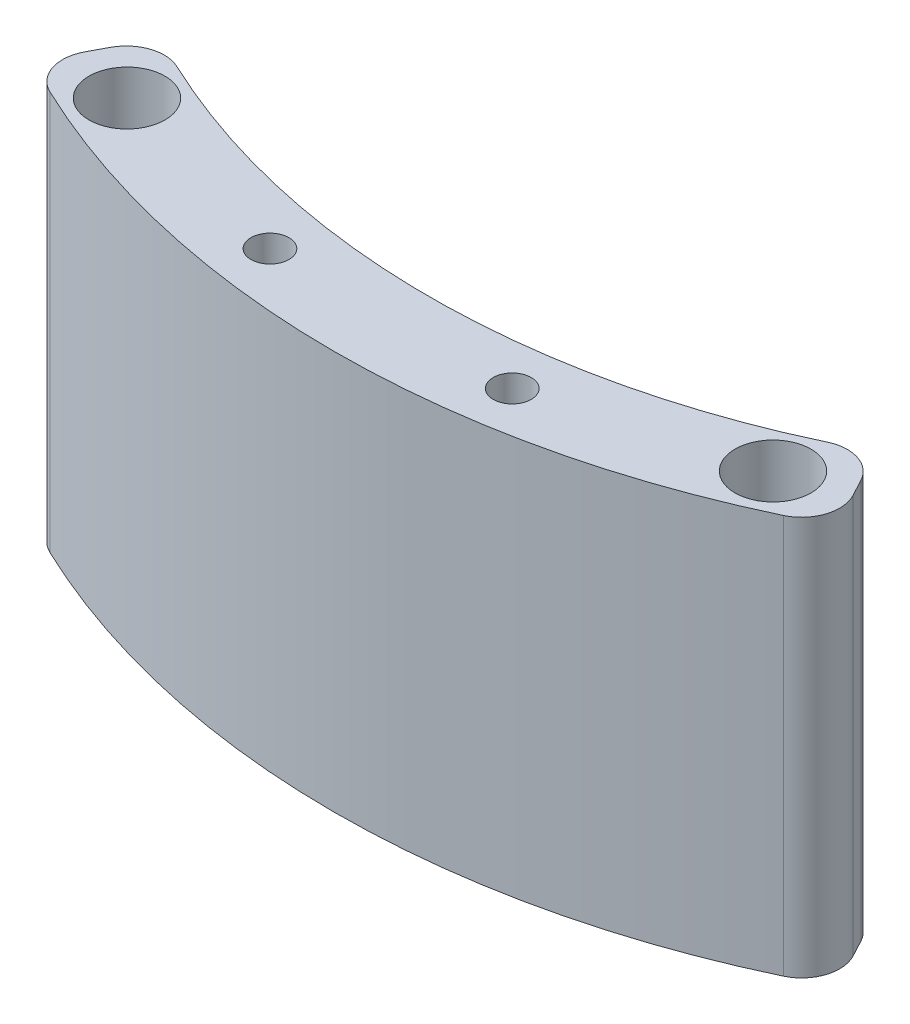
ISO-10303-21;
HEADER;
FILE_DESCRIPTION(('STEP AP214'),'2;1');
FILE_NAME('part.step','',(''),(''),'','','');
FILE_SCHEMA(('AUTOMOTIVE_DESIGN { 1 0 10303 214 1 1 1 1 }'));
ENDSEC;
DATA;
#1=APPLICATION_CONTEXT('core data for automotive mechanical design processes');
#2=APPLICATION_PROTOCOL_DEFINITION('international standard','automotive_design',2000,#1);
#3=PRODUCT_CONTEXT('',#1,'mechanical');
#4=PRODUCT('Part','Part','',(#3));
#5=PRODUCT_RELATED_PRODUCT_CATEGORY('part','',(#4));
#6=PRODUCT_DEFINITION_FORMATION('','',#4);
#7=PRODUCT_DEFINITION_CONTEXT('part definition',#1,'design');
#8=PRODUCT_DEFINITION('design','',#6,#7);
#9=PRODUCT_DEFINITION_SHAPE('','',#8);
#10=(LENGTH_UNIT() NAMED_UNIT(*) SI_UNIT(.MILLI.,.METRE.));
#11=(NAMED_UNIT(*) PLANE_ANGLE_UNIT() SI_UNIT($,.RADIAN.));
#12=(NAMED_UNIT(*) SI_UNIT($,.STERADIAN.) SOLID_ANGLE_UNIT());
#13=UNCERTAINTY_MEASURE_WITH_UNIT(LENGTH_MEASURE(1.E-05),#10,'distance_accuracy_value','');
#14=(GEOMETRIC_REPRESENTATION_CONTEXT(3) GLOBAL_UNCERTAINTY_ASSIGNED_CONTEXT((#13)) GLOBAL_UNIT_ASSIGNED_CONTEXT((#10,
#11,#12)) REPRESENTATION_CONTEXT('',''));
#15=CARTESIAN_POINT('',(0.,0.,0.));
#16=DIRECTION('',(0.,0.,1.));
#17=DIRECTION('',(1.,0.,0.));
#18=AXIS2_PLACEMENT_3D('',#15,#16,#17);
#19=CARTESIAN_POINT('',(0.,42.,-90.));
#20=DIRECTION('',(0.,-1.,0.));
#21=DIRECTION('',(0.,0.,-1.));
#22=AXIS2_PLACEMENT_3D('',#19,#20,#21);
#23=CYLINDRICAL_SURFACE('',#22,80.);
#24=CARTESIAN_POINT('',(0.,0.,-90.));
#25=DIRECTION('',(0.,-1.,0.));
#26=DIRECTION('',(0.,0.,1.));
#27=AXIS2_PLACEMENT_3D('',#24,#25,#26);
#28=CIRCLE('',#27,80.);
#29=CARTESIAN_POINT('',(34.2430063209466,0.,-17.699125052987));
#30=VERTEX_POINT('',#29);
#31=CARTESIAN_POINT('',(-34.2430063209466,0.,-17.699125052987));
#32=VERTEX_POINT('',#31);
#33=EDGE_CURVE('E139',#30,#32,#28,.T.);
#34=ORIENTED_EDGE('',*,*,#33,.T.);
#35=DIRECTION('',(0.,-1.,0.));
#36=VECTOR('',#35,1.);
#37=CARTESIAN_POINT('',(-34.2430063209466,42.,-17.699125052987));
#38=LINE('',#37,#36);
#39=CARTESIAN_POINT('',(-34.2430063209466,42.,-17.699125052987));
#40=VERTEX_POINT('',#39);
#41=EDGE_CURVE('E114',#32,#40,#38,.F.);
#42=ORIENTED_EDGE('',*,*,#41,.T.);
#43=CARTESIAN_POINT('',(0.,42.,-90.));
#44=DIRECTION('',(0.,-1.,0.));
#45=DIRECTION('',(0.,0.,1.));
#46=AXIS2_PLACEMENT_3D('',#43,#44,#45);
#47=CIRCLE('',#46,80.);
#48=CARTESIAN_POINT('',(34.2430063209466,42.,-17.699125052987));
#49=VERTEX_POINT('',#48);
#50=EDGE_CURVE('E152',#49,#40,#47,.T.);
#51=ORIENTED_EDGE('',*,*,#50,.F.);
#52=DIRECTION('',(0.,-1.,0.));
#53=VECTOR('',#52,1.);
#54=CARTESIAN_POINT('',(34.2430063209466,42.,-17.699125052987));
#55=LINE('',#54,#53);
#56=EDGE_CURVE('E120',#49,#30,#55,.T.);
#57=ORIENTED_EDGE('',*,*,#56,.T.);
#58=EDGE_LOOP('',(#34,#42,#51,#57));
#59=FACE_BOUND('',#58,.T.);
#60=ADVANCED_FACE('F43',(#59),#23,.F.);
#61=CARTESIAN_POINT('',(-37.6470588235294,42.,-19.4117647058824));
#62=DIRECTION('',(0.882352941176471,0.,0.470588235294117));
#63=DIRECTION('',(0.470588235294117,0.,-0.882352941176471));
#64=AXIS2_PLACEMENT_3D('',#61,#62,#63);
#65=PLANE('',#64);
#66=DIRECTION('',(-0.470588235294117,0.,0.882352941176471));
#67=VECTOR('',#66,1.);
#68=CARTESIAN_POINT('',(-37.6470588235294,42.,-19.4117647058824));
#69=LINE('',#68,#67);
#70=CARTESIAN_POINT('',(-39.4845684016998,42.,-15.9664342468128));
#71=VERTEX_POINT('',#70);
#72=CARTESIAN_POINT('',(-40.426788884545,42.,-14.1997708414781));
#73=VERTEX_POINT('',#72);
#74=EDGE_CURVE('E130',#71,#73,#69,.T.);
#75=ORIENTED_EDGE('',*,*,#74,.F.);
#76=DIRECTION('',(0.,-1.,0.));
#77=VECTOR('',#76,1.);
#78=CARTESIAN_POINT('',(-39.4845684016998,42.,-15.9664342468128));
#79=LINE('',#78,#77);
#80=CARTESIAN_POINT('',(-39.4845684016998,0.,-15.9664342468128));
#81=VERTEX_POINT('',#80);
#82=EDGE_CURVE('E113',#71,#81,#79,.T.);
#83=ORIENTED_EDGE('',*,*,#82,.T.);
#84=DIRECTION('',(-0.470588235294117,0.,0.882352941176471));
#85=VECTOR('',#84,1.);
#86=CARTESIAN_POINT('',(-37.6470588235294,0.,-19.4117647058824));
#87=LINE('',#86,#85);
#88=CARTESIAN_POINT('',(-40.426788884545,0.,-14.1997708414781));
#89=VERTEX_POINT('',#88);
#90=EDGE_CURVE('E127',#81,#89,#87,.T.);
#91=ORIENTED_EDGE('',*,*,#90,.T.);
#92=DIRECTION('',(0.,-1.,0.));
#93=VECTOR('',#92,1.);
#94=CARTESIAN_POINT('',(-40.426788884545,42.,-14.1997708414781));
#95=LINE('',#94,#93);
#96=EDGE_CURVE('E133',#89,#73,#95,.F.);
#97=ORIENTED_EDGE('',*,*,#96,.T.);
#98=EDGE_LOOP('',(#75,#83,#91,#97));
#99=FACE_BOUND('',#98,.T.);
#100=ADVANCED_FACE('F126',(#99),#65,.F.);
#101=CARTESIAN_POINT('',(0.,42.,-90.));
#102=DIRECTION('',(0.,-1.,0.));
#103=DIRECTION('',(0.,0.,-1.));
#104=AXIS2_PLACEMENT_3D('',#101,#102,#103);
#105=CYLINDRICAL_SURFACE('',#104,90.);
#106=CARTESIAN_POINT('',(0.,42.,-90.));
#107=DIRECTION('',(0.,1.,0.));
#108=DIRECTION('',(0.,0.,1.));
#109=AXIS2_PLACEMENT_3D('',#106,#107,#108);
#110=CIRCLE('',#109,90.);
#111=CARTESIAN_POINT('',(-38.6135341951805,42.,-8.70427454682732));
#112=VERTEX_POINT('',#111);
#113=CARTESIAN_POINT('',(38.6135341951805,42.,-8.70427454682732));
#114=VERTEX_POINT('',#113);
#115=EDGE_CURVE('E201',#112,#114,#110,.T.);
#116=ORIENTED_EDGE('',*,*,#115,.F.);
#117=DIRECTION('',(0.,-1.,0.));
#118=VECTOR('',#117,1.);
#119=CARTESIAN_POINT('',(-38.6135341951805,42.,-8.70427454682732));
#120=LINE('',#119,#118);
#121=CARTESIAN_POINT('',(-38.6135341951805,0.,-8.70427454682732));
#122=VERTEX_POINT('',#121);
#123=EDGE_CURVE('E182',#112,#122,#120,.T.);
#124=ORIENTED_EDGE('',*,*,#123,.T.);
#125=CARTESIAN_POINT('',(0.,0.,-90.));
#126=DIRECTION('',(0.,1.,0.));
#127=DIRECTION('',(0.,0.,1.));
#128=AXIS2_PLACEMENT_3D('',#125,#126,#127);
#129=CIRCLE('',#128,90.);
#130=CARTESIAN_POINT('',(38.6135341951805,0.,-8.70427454682732));
#131=VERTEX_POINT('',#130);
#132=EDGE_CURVE('E138',#122,#131,#129,.T.);
#133=ORIENTED_EDGE('',*,*,#132,.T.);
#134=DIRECTION('',(0.,-1.,0.));
#135=VECTOR('',#134,1.);
#136=CARTESIAN_POINT('',(38.6135341951805,42.,-8.70427454682732));
#137=LINE('',#136,#135);
#138=EDGE_CURVE('E179',#131,#114,#137,.F.);
#139=ORIENTED_EDGE('',*,*,#138,.T.);
#140=EDGE_LOOP('',(#116,#124,#133,#139));
#141=FACE_BOUND('',#140,.T.);
#142=ADVANCED_FACE('F219',(#141),#105,.T.);
#143=CARTESIAN_POINT('',(37.6470588235294,42.,-19.4117647058823));
#144=DIRECTION('',(-0.88235294117647,0.,0.470588235294118));
#145=DIRECTION('',(0.470588235294118,0.,0.88235294117647));
#146=AXIS2_PLACEMENT_3D('',#143,#144,#145);
#147=PLANE('',#146);
#148=DIRECTION('',(-0.470588235294118,0.,-0.88235294117647));
#149=VECTOR('',#148,1.);
#150=CARTESIAN_POINT('',(37.6470588235294,0.,-19.4117647058823));
#151=LINE('',#150,#149);
#152=CARTESIAN_POINT('',(40.426788884545,0.,-14.1997708414781));
#153=VERTEX_POINT('',#152);
#154=CARTESIAN_POINT('',(39.4845684016998,0.,-15.9664342468128));
#155=VERTEX_POINT('',#154);
#156=EDGE_CURVE('E144',#153,#155,#151,.T.);
#157=ORIENTED_EDGE('',*,*,#156,.T.);
#158=DIRECTION('',(0.,-1.,0.));
#159=VECTOR('',#158,1.);
#160=CARTESIAN_POINT('',(39.4845684016998,42.,-15.9664342468128));
#161=LINE('',#160,#159);
#162=CARTESIAN_POINT('',(39.4845684016998,42.,-15.9664342468128));
#163=VERTEX_POINT('',#162);
#164=EDGE_CURVE('E11',#155,#163,#161,.F.);
#165=ORIENTED_EDGE('',*,*,#164,.T.);
#166=DIRECTION('',(-0.470588235294118,0.,-0.88235294117647));
#167=VECTOR('',#166,1.);
#168=CARTESIAN_POINT('',(37.6470588235294,42.,-19.4117647058823));
#169=LINE('',#168,#167);
#170=CARTESIAN_POINT('',(40.426788884545,42.,-14.1997708414781));
#171=VERTEX_POINT('',#170);
#172=EDGE_CURVE('E154',#171,#163,#169,.T.);
#173=ORIENTED_EDGE('',*,*,#172,.F.);
#174=DIRECTION('',(0.,-1.,0.));
#175=VECTOR('',#174,1.);
#176=CARTESIAN_POINT('',(40.426788884545,42.,-14.1997708414781));
#177=LINE('',#176,#175);
#178=EDGE_CURVE('E52',#171,#153,#177,.T.);
#179=ORIENTED_EDGE('',*,*,#178,.T.);
#180=EDGE_LOOP('',(#157,#165,#173,#179));
#181=FACE_BOUND('',#180,.T.);
#182=ADVANCED_FACE('F189',(#181),#147,.F.);
#183=CARTESIAN_POINT('',(0.,42.,-90.));
#184=DIRECTION('',(0.,1.,0.));
#185=DIRECTION('',(0.,0.,1.));
#186=AXIS2_PLACEMENT_3D('',#183,#184,#185);
#187=PLANE('',#186);
#188=CARTESIAN_POINT('',(-12.75,42.,-6.));
#189=DIRECTION('',(0.,1.,0.));
#190=DIRECTION('',(0.,0.,1.));
#191=AXIS2_PLACEMENT_3D('',#188,#189,#190);
#192=CIRCLE('',#191,2.);
#193=CARTESIAN_POINT('',(-12.75,42.,-4.));
#194=VERTEX_POINT('',#193);
#195=EDGE_CURVE('E373',#194,#194,#192,.T.);
#196=ORIENTED_EDGE('',*,*,#195,.F.);
#197=EDGE_LOOP('',(#196));
#198=FACE_BOUND('',#197,.T.);
#199=CARTESIAN_POINT('',(12.75,42.,-6.));
#200=DIRECTION('',(0.,1.,0.));
#201=DIRECTION('',(0.,0.,1.));
#202=AXIS2_PLACEMENT_3D('',#199,#200,#201);
#203=CIRCLE('',#202,2.);
#204=CARTESIAN_POINT('',(12.75,42.,-4.));
#205=VERTEX_POINT('',#204);
#206=EDGE_CURVE('E375',#205,#205,#203,.T.);
#207=ORIENTED_EDGE('',*,*,#206,.F.);
#208=EDGE_LOOP('',(#207));
#209=FACE_BOUND('',#208,.T.);
#210=CARTESIAN_POINT('',(-34.,42.,-12.2));
#211=DIRECTION('',(0.,1.,0.));
#212=DIRECTION('',(0.,0.,1.));
#213=AXIS2_PLACEMENT_3D('',#210,#211,#212);
#214=CIRCLE('',#213,4.);
#215=CARTESIAN_POINT('',(-34.,42.,-8.2));
#216=VERTEX_POINT('',#215);
#217=EDGE_CURVE('E390',#216,#216,#214,.T.);
#218=ORIENTED_EDGE('',*,*,#217,.F.);
#219=EDGE_LOOP('',(#218));
#220=FACE_BOUND('',#219,.T.);
#221=CARTESIAN_POINT('',(34.,42.,-12.2));
#222=DIRECTION('',(0.,1.,0.));
#223=DIRECTION('',(0.,0.,1.));
#224=AXIS2_PLACEMENT_3D('',#221,#222,#223);
#225=CIRCLE('',#224,4.);
#226=CARTESIAN_POINT('',(34.,42.,-8.20000000000001));
#227=VERTEX_POINT('',#226);
#228=EDGE_CURVE('E393',#227,#227,#225,.T.);
#229=ORIENTED_EDGE('',*,*,#228,.F.);
#230=EDGE_LOOP('',(#229));
#231=FACE_BOUND('',#230,.T.);
#232=ORIENTED_EDGE('',*,*,#50,.T.);
#233=CARTESIAN_POINT('',(-35.9551566369939,42.,-14.0840813056364));
#234=DIRECTION('',(0.,1.,0.));
#235=DIRECTION('',(0.,0.,1.));
#236=AXIS2_PLACEMENT_3D('',#233,#234,#235);
#237=CIRCLE('',#236,4.);
#238=EDGE_CURVE('E176',#40,#71,#237,.T.);
#239=ORIENTED_EDGE('',*,*,#238,.T.);
#240=ORIENTED_EDGE('',*,*,#74,.T.);
#241=CARTESIAN_POINT('',(-36.8973771198391,42.,-12.3174179003017));
#242=DIRECTION('',(0.,1.,0.));
#243=DIRECTION('',(0.,0.,1.));
#244=AXIS2_PLACEMENT_3D('',#241,#242,#243);
#245=CIRCLE('',#244,4.);
#246=EDGE_CURVE('E173',#73,#112,#245,.T.);
#247=ORIENTED_EDGE('',*,*,#246,.T.);
#248=ORIENTED_EDGE('',*,*,#115,.T.);
#249=CARTESIAN_POINT('',(36.8973771198391,42.,-12.3174179003017));
#250=DIRECTION('',(0.,1.,0.));
#251=DIRECTION('',(0.,0.,1.));
#252=AXIS2_PLACEMENT_3D('',#249,#250,#251);
#253=CIRCLE('',#252,4.);
#254=EDGE_CURVE('E64',#114,#171,#253,.T.);
#255=ORIENTED_EDGE('',*,*,#254,.T.);
#256=ORIENTED_EDGE('',*,*,#172,.T.);
#257=CARTESIAN_POINT('',(35.9551566369939,42.,-14.0840813056364));
#258=DIRECTION('',(0.,1.,0.));
#259=DIRECTION('',(0.,0.,1.));
#260=AXIS2_PLACEMENT_3D('',#257,#258,#259);
#261=CIRCLE('',#260,4.);
#262=EDGE_CURVE('E170',#163,#49,#261,.T.);
#263=ORIENTED_EDGE('',*,*,#262,.T.);
#264=EDGE_LOOP('',(#232,#239,#240,#247,#248,#255,#256,#263));
#265=FACE_BOUND('',#264,.T.);
#266=ADVANCED_FACE('F209',(#198,#209,#220,#231,#265),#187,.T.);
#267=CARTESIAN_POINT('',(0.,0.,-90.));
#268=DIRECTION('',(0.,1.,0.));
#269=DIRECTION('',(0.,0.,1.));
#270=AXIS2_PLACEMENT_3D('',#267,#268,#269);
#271=PLANE('',#270);
#272=CARTESIAN_POINT('',(-12.75,0.,-6.));
#273=DIRECTION('',(0.,1.,0.));
#274=DIRECTION('',(0.,0.,1.));
#275=AXIS2_PLACEMENT_3D('',#272,#273,#274);
#276=CIRCLE('',#275,2.);
#277=CARTESIAN_POINT('',(-12.75,0.,-4.));
#278=VERTEX_POINT('',#277);
#279=EDGE_CURVE('E371',#278,#278,#276,.T.);
#280=ORIENTED_EDGE('',*,*,#279,.T.);
#281=EDGE_LOOP('',(#280));
#282=FACE_BOUND('',#281,.T.);
#283=CARTESIAN_POINT('',(12.75,0.,-6.));
#284=DIRECTION('',(0.,1.,0.));
#285=DIRECTION('',(0.,0.,1.));
#286=AXIS2_PLACEMENT_3D('',#283,#284,#285);
#287=CIRCLE('',#286,2.);
#288=CARTESIAN_POINT('',(12.75,0.,-4.));
#289=VERTEX_POINT('',#288);
#290=EDGE_CURVE('E381',#289,#289,#287,.T.);
#291=ORIENTED_EDGE('',*,*,#290,.T.);
#292=EDGE_LOOP('',(#291));
#293=FACE_BOUND('',#292,.T.);
#294=CARTESIAN_POINT('',(-34.,0.,-12.2));
#295=DIRECTION('',(0.,1.,0.));
#296=DIRECTION('',(0.,0.,1.));
#297=AXIS2_PLACEMENT_3D('',#294,#295,#296);
#298=CIRCLE('',#297,4.);
#299=CARTESIAN_POINT('',(-34.,0.,-8.2));
#300=VERTEX_POINT('',#299);
#301=EDGE_CURVE('E146',#300,#300,#298,.T.);
#302=ORIENTED_EDGE('',*,*,#301,.T.);
#303=EDGE_LOOP('',(#302));
#304=FACE_BOUND('',#303,.T.);
#305=CARTESIAN_POINT('',(34.,0.,-12.2));
#306=DIRECTION('',(0.,1.,0.));
#307=DIRECTION('',(0.,0.,1.));
#308=AXIS2_PLACEMENT_3D('',#305,#306,#307);
#309=CIRCLE('',#308,4.);
#310=CARTESIAN_POINT('',(34.,0.,-8.20000000000001));
#311=VERTEX_POINT('',#310);
#312=EDGE_CURVE('E204',#311,#311,#309,.T.);
#313=ORIENTED_EDGE('',*,*,#312,.T.);
#314=EDGE_LOOP('',(#313));
#315=FACE_BOUND('',#314,.T.);
#316=ORIENTED_EDGE('',*,*,#90,.F.);
#317=CARTESIAN_POINT('',(-35.9551566369939,0.,-14.0840813056364));
#318=DIRECTION('',(0.,1.,0.));
#319=DIRECTION('',(0.,0.,1.));
#320=AXIS2_PLACEMENT_3D('',#317,#318,#319);
#321=CIRCLE('',#320,4.);
#322=EDGE_CURVE('E109',#81,#32,#321,.F.);
#323=ORIENTED_EDGE('',*,*,#322,.T.);
#324=ORIENTED_EDGE('',*,*,#33,.F.);
#325=CARTESIAN_POINT('',(35.9551566369939,0.,-14.0840813056364));
#326=DIRECTION('',(0.,1.,0.));
#327=DIRECTION('',(0.,0.,1.));
#328=AXIS2_PLACEMENT_3D('',#325,#326,#327);
#329=CIRCLE('',#328,4.);
#330=EDGE_CURVE('E158',#30,#155,#329,.F.);
#331=ORIENTED_EDGE('',*,*,#330,.T.);
#332=ORIENTED_EDGE('',*,*,#156,.F.);
#333=CARTESIAN_POINT('',(36.8973771198391,0.,-12.3174179003017));
#334=DIRECTION('',(0.,1.,0.));
#335=DIRECTION('',(0.,0.,1.));
#336=AXIS2_PLACEMENT_3D('',#333,#334,#335);
#337=CIRCLE('',#336,4.);
#338=EDGE_CURVE('E132',#153,#131,#337,.F.);
#339=ORIENTED_EDGE('',*,*,#338,.T.);
#340=ORIENTED_EDGE('',*,*,#132,.F.);
#341=CARTESIAN_POINT('',(-36.8973771198391,0.,-12.3174179003017));
#342=DIRECTION('',(0.,1.,0.));
#343=DIRECTION('',(0.,0.,1.));
#344=AXIS2_PLACEMENT_3D('',#341,#342,#343);
#345=CIRCLE('',#344,4.);
#346=EDGE_CURVE('E121',#122,#89,#345,.F.);
#347=ORIENTED_EDGE('',*,*,#346,.T.);
#348=EDGE_LOOP('',(#316,#323,#324,#331,#332,#339,#340,#347));
#349=FACE_BOUND('',#348,.T.);
#350=ADVANCED_FACE('F135',(#282,#293,#304,#315,#349),#271,.F.);
#351=CARTESIAN_POINT('',(-35.9551566369939,42.,-14.0840813056364));
#352=DIRECTION('',(0.,-1.,0.));
#353=DIRECTION('',(0.,0.,-1.));
#354=AXIS2_PLACEMENT_3D('',#351,#352,#353);
#355=CYLINDRICAL_SURFACE('',#354,4.);
#356=ORIENTED_EDGE('',*,*,#238,.F.);
#357=ORIENTED_EDGE('',*,*,#41,.F.);
#358=ORIENTED_EDGE('',*,*,#322,.F.);
#359=ORIENTED_EDGE('',*,*,#82,.F.);
#360=EDGE_LOOP('',(#356,#357,#358,#359));
#361=FACE_BOUND('',#360,.T.);
#362=ADVANCED_FACE('F112',(#361),#355,.T.);
#363=CARTESIAN_POINT('',(-36.8973771198391,42.,-12.3174179003017));
#364=DIRECTION('',(0.,-1.,0.));
#365=DIRECTION('',(0.,0.,-1.));
#366=AXIS2_PLACEMENT_3D('',#363,#364,#365);
#367=CYLINDRICAL_SURFACE('',#366,4.);
#368=ORIENTED_EDGE('',*,*,#246,.F.);
#369=ORIENTED_EDGE('',*,*,#96,.F.);
#370=ORIENTED_EDGE('',*,*,#346,.F.);
#371=ORIENTED_EDGE('',*,*,#123,.F.);
#372=EDGE_LOOP('',(#368,#369,#370,#371));
#373=FACE_BOUND('',#372,.T.);
#374=ADVANCED_FACE('F234',(#373),#367,.T.);
#375=CARTESIAN_POINT('',(35.9551566369939,42.,-14.0840813056364));
#376=DIRECTION('',(0.,-1.,0.));
#377=DIRECTION('',(0.,0.,-1.));
#378=AXIS2_PLACEMENT_3D('',#375,#376,#377);
#379=CYLINDRICAL_SURFACE('',#378,4.);
#380=ORIENTED_EDGE('',*,*,#262,.F.);
#381=ORIENTED_EDGE('',*,*,#164,.F.);
#382=ORIENTED_EDGE('',*,*,#330,.F.);
#383=ORIENTED_EDGE('',*,*,#56,.F.);
#384=EDGE_LOOP('',(#380,#381,#382,#383));
#385=FACE_BOUND('',#384,.T.);
#386=ADVANCED_FACE('F194',(#385),#379,.T.);
#387=CARTESIAN_POINT('',(36.8973771198391,42.,-12.3174179003017));
#388=DIRECTION('',(0.,-1.,0.));
#389=DIRECTION('',(0.,0.,-1.));
#390=AXIS2_PLACEMENT_3D('',#387,#388,#389);
#391=CYLINDRICAL_SURFACE('',#390,4.);
#392=ORIENTED_EDGE('',*,*,#254,.F.);
#393=ORIENTED_EDGE('',*,*,#138,.F.);
#394=ORIENTED_EDGE('',*,*,#338,.F.);
#395=ORIENTED_EDGE('',*,*,#178,.F.);
#396=EDGE_LOOP('',(#392,#393,#394,#395));
#397=FACE_BOUND('',#396,.T.);
#398=ADVANCED_FACE('F45',(#397),#391,.T.);
#399=CARTESIAN_POINT('',(34.,0.,-12.2));
#400=DIRECTION('',(0.,1.,0.));
#401=DIRECTION('',(0.,0.,1.));
#402=AXIS2_PLACEMENT_3D('',#399,#400,#401);
#403=CYLINDRICAL_SURFACE('',#402,4.);
#404=CARTESIAN_POINT('',(34.,0.,-8.20000000000001));
#405=CARTESIAN_POINT('',(34.,0.437499999999999,-8.20000000000001));
#406=CARTESIAN_POINT('',(34.,0.875,-8.20000000000001));
#407=CARTESIAN_POINT('',(34.,1.75,-8.20000000000001));
#408=CARTESIAN_POINT('',(34.,2.1875,-8.20000000000001));
#409=CARTESIAN_POINT('',(34.,3.0625,-8.20000000000001));
#410=CARTESIAN_POINT('',(34.,3.5,-8.20000000000001));
#411=CARTESIAN_POINT('',(34.,4.375,-8.20000000000001));
#412=CARTESIAN_POINT('',(34.,4.8125,-8.20000000000001));
#413=CARTESIAN_POINT('',(34.,5.6875,-8.20000000000001));
#414=CARTESIAN_POINT('',(34.,6.125,-8.20000000000001));
#415=CARTESIAN_POINT('',(34.,7.,-8.20000000000001));
#416=CARTESIAN_POINT('',(34.,7.4375,-8.20000000000001));
#417=CARTESIAN_POINT('',(34.,8.3125,-8.20000000000001));
#418=CARTESIAN_POINT('',(34.,8.75,-8.20000000000001));
#419=CARTESIAN_POINT('',(34.,9.625,-8.20000000000001));
#420=CARTESIAN_POINT('',(34.,10.0625,-8.20000000000001));
#421=CARTESIAN_POINT('',(34.,10.9375,-8.20000000000001));
#422=CARTESIAN_POINT('',(34.,11.375,-8.20000000000001));
#423=CARTESIAN_POINT('',(34.,12.25,-8.20000000000001));
#424=CARTESIAN_POINT('',(34.,12.6875,-8.20000000000001));
#425=CARTESIAN_POINT('',(34.,13.5625,-8.20000000000001));
#426=CARTESIAN_POINT('',(34.,14.,-8.20000000000001));
#427=CARTESIAN_POINT('',(34.,14.875,-8.20000000000001));
#428=CARTESIAN_POINT('',(34.,15.3125,-8.20000000000001));
#429=CARTESIAN_POINT('',(34.,16.1875,-8.20000000000001));
#430=CARTESIAN_POINT('',(34.,16.625,-8.20000000000001));
#431=CARTESIAN_POINT('',(34.,17.5,-8.20000000000001));
#432=CARTESIAN_POINT('',(34.,17.9375,-8.20000000000001));
#433=CARTESIAN_POINT('',(34.,18.8125,-8.20000000000001));
#434=CARTESIAN_POINT('',(34.,19.25,-8.20000000000001));
#435=CARTESIAN_POINT('',(34.,20.125,-8.20000000000001));
#436=CARTESIAN_POINT('',(34.,20.5625,-8.20000000000001));
#437=CARTESIAN_POINT('',(34.,21.4375,-8.20000000000001));
#438=CARTESIAN_POINT('',(34.,21.875,-8.20000000000001));
#439=CARTESIAN_POINT('',(34.,22.75,-8.20000000000001));
#440=CARTESIAN_POINT('',(34.,23.1875,-8.20000000000001));
#441=CARTESIAN_POINT('',(34.,24.0625,-8.20000000000001));
#442=CARTESIAN_POINT('',(34.,24.5,-8.20000000000001));
#443=CARTESIAN_POINT('',(34.,25.375,-8.20000000000001));
#444=CARTESIAN_POINT('',(34.,25.8125,-8.20000000000001));
#445=CARTESIAN_POINT('',(34.,26.6875,-8.20000000000001));
#446=CARTESIAN_POINT('',(34.,27.125,-8.20000000000001));
#447=CARTESIAN_POINT('',(34.,28.,-8.20000000000001));
#448=CARTESIAN_POINT('',(34.,28.4375,-8.20000000000001));
#449=CARTESIAN_POINT('',(34.,29.3125,-8.20000000000001));
#450=CARTESIAN_POINT('',(34.,29.75,-8.20000000000001));
#451=CARTESIAN_POINT('',(34.,30.625,-8.20000000000001));
#452=CARTESIAN_POINT('',(34.,31.0625,-8.20000000000001));
#453=CARTESIAN_POINT('',(34.,31.9375,-8.20000000000001));
#454=CARTESIAN_POINT('',(34.,32.375,-8.20000000000001));
#455=CARTESIAN_POINT('',(34.,33.25,-8.20000000000001));
#456=CARTESIAN_POINT('',(34.,33.6875,-8.20000000000001));
#457=CARTESIAN_POINT('',(34.,34.5625,-8.20000000000001));
#458=CARTESIAN_POINT('',(34.,35.,-8.20000000000001));
#459=CARTESIAN_POINT('',(34.,35.875,-8.20000000000001));
#460=CARTESIAN_POINT('',(34.,36.3125,-8.20000000000001));
#461=CARTESIAN_POINT('',(34.,37.1875,-8.20000000000001));
#462=CARTESIAN_POINT('',(34.,37.625,-8.20000000000001));
#463=CARTESIAN_POINT('',(34.,38.5,-8.20000000000001));
#464=CARTESIAN_POINT('',(34.,38.9375,-8.20000000000001));
#465=CARTESIAN_POINT('',(34.,39.8125,-8.20000000000001));
#466=CARTESIAN_POINT('',(34.,40.25,-8.20000000000001));
#467=CARTESIAN_POINT('',(34.,41.125,-8.20000000000001));
#468=CARTESIAN_POINT('',(34.,41.5625,-8.20000000000001));
#469=CARTESIAN_POINT('',(34.,42.,-8.20000000000001));
#470=B_SPLINE_CURVE_WITH_KNOTS('',3,(#404,#405,#406,#407,#408,#409,#410,#411,#412,#413,#414,
#415,#416,#417,#418,#419,#420,#421,#422,#423,#424,#425,#426,#427,#428,#429,#430,#431,#432,#433,
#434,#435,#436,#437,#438,#439,#440,#441,#442,#443,#444,#445,#446,#447,#448,#449,#450,#451,#452,
#453,#454,#455,#456,#457,#458,#459,#460,#461,#462,#463,#464,#465,#466,#467,#468,#469),
.UNSPECIFIED.,.F.,.F.,(4,2,2,2,2,2,2,2,2,2,2,2,2,2,2,2,2,2,2,2,2,2,2,2,2,2,2,2,2,2,2,2,4),(0.,
1.3125,2.625,3.9375,5.25,6.5625,7.875,9.1875,10.5,11.8125,13.125,14.4375,15.75,17.0625,18.375,
19.6875,21.,22.3125,23.625,24.9375,26.25,27.5625,28.875,30.1875,31.5,32.8125,34.125,35.4375,
36.75,38.0625,39.375,40.6875,42.),.UNSPECIFIED.);
#471=EDGE_CURVE('BSEAM241',#311,#227,#470,.T.);
#472=ORIENTED_EDGE('',*,*,#312,.F.);
#473=ORIENTED_EDGE('',*,*,#228,.T.);
#474=ORIENTED_EDGE('',*,*,#471,.T.);
#475=ORIENTED_EDGE('',*,*,#471,.F.);
#476=EDGE_LOOP('',(#472,#474,#473,#475));
#477=FACE_BOUND('',#476,.T.);
#478=ADVANCED_FACE('F241',(#477),#403,.F.);
#479=CARTESIAN_POINT('',(-34.,0.,-12.2));
#480=DIRECTION('',(0.,1.,0.));
#481=DIRECTION('',(0.,0.,1.));
#482=AXIS2_PLACEMENT_3D('',#479,#480,#481);
#483=CYLINDRICAL_SURFACE('',#482,4.);
#484=CARTESIAN_POINT('',(-34.,0.,-8.2));
#485=CARTESIAN_POINT('',(-34.,0.437499999999999,-8.2));
#486=CARTESIAN_POINT('',(-34.,0.875,-8.2));
#487=CARTESIAN_POINT('',(-34.,1.75,-8.2));
#488=CARTESIAN_POINT('',(-34.,2.1875,-8.2));
#489=CARTESIAN_POINT('',(-34.,3.0625,-8.2));
#490=CARTESIAN_POINT('',(-34.,3.5,-8.2));
#491=CARTESIAN_POINT('',(-34.,4.375,-8.2));
#492=CARTESIAN_POINT('',(-34.,4.8125,-8.2));
#493=CARTESIAN_POINT('',(-34.,5.6875,-8.2));
#494=CARTESIAN_POINT('',(-34.,6.125,-8.2));
#495=CARTESIAN_POINT('',(-34.,7.,-8.2));
#496=CARTESIAN_POINT('',(-34.,7.4375,-8.2));
#497=CARTESIAN_POINT('',(-34.,8.3125,-8.2));
#498=CARTESIAN_POINT('',(-34.,8.75,-8.2));
#499=CARTESIAN_POINT('',(-34.,9.625,-8.2));
#500=CARTESIAN_POINT('',(-34.,10.0625,-8.2));
#501=CARTESIAN_POINT('',(-34.,10.9375,-8.2));
#502=CARTESIAN_POINT('',(-34.,11.375,-8.2));
#503=CARTESIAN_POINT('',(-34.,12.25,-8.2));
#504=CARTESIAN_POINT('',(-34.,12.6875,-8.2));
#505=CARTESIAN_POINT('',(-34.,13.5625,-8.2));
#506=CARTESIAN_POINT('',(-34.,14.,-8.2));
#507=CARTESIAN_POINT('',(-34.,14.875,-8.2));
#508=CARTESIAN_POINT('',(-34.,15.3125,-8.2));
#509=CARTESIAN_POINT('',(-34.,16.1875,-8.2));
#510=CARTESIAN_POINT('',(-34.,16.625,-8.2));
#511=CARTESIAN_POINT('',(-34.,17.5,-8.2));
#512=CARTESIAN_POINT('',(-34.,17.9375,-8.2));
#513=CARTESIAN_POINT('',(-34.,18.8125,-8.2));
#514=CARTESIAN_POINT('',(-34.,19.25,-8.2));
#515=CARTESIAN_POINT('',(-34.,20.125,-8.2));
#516=CARTESIAN_POINT('',(-34.,20.5625,-8.2));
#517=CARTESIAN_POINT('',(-34.,21.4375,-8.2));
#518=CARTESIAN_POINT('',(-34.,21.875,-8.2));
#519=CARTESIAN_POINT('',(-34.,22.75,-8.2));
#520=CARTESIAN_POINT('',(-34.,23.1875,-8.2));
#521=CARTESIAN_POINT('',(-34.,24.0625,-8.2));
#522=CARTESIAN_POINT('',(-34.,24.5,-8.2));
#523=CARTESIAN_POINT('',(-34.,25.375,-8.2));
#524=CARTESIAN_POINT('',(-34.,25.8125,-8.2));
#525=CARTESIAN_POINT('',(-34.,26.6875,-8.2));
#526=CARTESIAN_POINT('',(-34.,27.125,-8.2));
#527=CARTESIAN_POINT('',(-34.,28.,-8.2));
#528=CARTESIAN_POINT('',(-34.,28.4375,-8.2));
#529=CARTESIAN_POINT('',(-34.,29.3125,-8.2));
#530=CARTESIAN_POINT('',(-34.,29.75,-8.2));
#531=CARTESIAN_POINT('',(-34.,30.625,-8.2));
#532=CARTESIAN_POINT('',(-34.,31.0625,-8.2));
#533=CARTESIAN_POINT('',(-34.,31.9375,-8.2));
#534=CARTESIAN_POINT('',(-34.,32.375,-8.2));
#535=CARTESIAN_POINT('',(-34.,33.25,-8.2));
#536=CARTESIAN_POINT('',(-34.,33.6875,-8.2));
#537=CARTESIAN_POINT('',(-34.,34.5625,-8.2));
#538=CARTESIAN_POINT('',(-34.,35.,-8.2));
#539=CARTESIAN_POINT('',(-34.,35.875,-8.2));
#540=CARTESIAN_POINT('',(-34.,36.3125,-8.2));
#541=CARTESIAN_POINT('',(-34.,37.1875,-8.2));
#542=CARTESIAN_POINT('',(-34.,37.625,-8.2));
#543=CARTESIAN_POINT('',(-34.,38.5,-8.2));
#544=CARTESIAN_POINT('',(-34.,38.9375,-8.2));
#545=CARTESIAN_POINT('',(-34.,39.8125,-8.2));
#546=CARTESIAN_POINT('',(-34.,40.25,-8.2));
#547=CARTESIAN_POINT('',(-34.,41.125,-8.2));
#548=CARTESIAN_POINT('',(-34.,41.5625,-8.2));
#549=CARTESIAN_POINT('',(-34.,42.,-8.2));
#550=B_SPLINE_CURVE_WITH_KNOTS('',3,(#484,#485,#486,#487,#488,#489,#490,#491,#492,#493,#494,
#495,#496,#497,#498,#499,#500,#501,#502,#503,#504,#505,#506,#507,#508,#509,#510,#511,#512,#513,
#514,#515,#516,#517,#518,#519,#520,#521,#522,#523,#524,#525,#526,#527,#528,#529,#530,#531,#532,
#533,#534,#535,#536,#537,#538,#539,#540,#541,#542,#543,#544,#545,#546,#547,#548,#549),
.UNSPECIFIED.,.F.,.F.,(4,2,2,2,2,2,2,2,2,2,2,2,2,2,2,2,2,2,2,2,2,2,2,2,2,2,2,2,2,2,2,2,4),(0.,
1.3125,2.625,3.9375,5.25,6.5625,7.875,9.1875,10.5,11.8125,13.125,14.4375,15.75,17.0625,18.375,
19.6875,21.,22.3125,23.625,24.9375,26.25,27.5625,28.875,30.1875,31.5,32.8125,34.125,35.4375,
36.75,38.0625,39.375,40.6875,42.),.UNSPECIFIED.);
#551=EDGE_CURVE('BSEAM245',#300,#216,#550,.T.);
#552=ORIENTED_EDGE('',*,*,#301,.F.);
#553=ORIENTED_EDGE('',*,*,#217,.T.);
#554=ORIENTED_EDGE('',*,*,#551,.T.);
#555=ORIENTED_EDGE('',*,*,#551,.F.);
#556=EDGE_LOOP('',(#552,#554,#553,#555));
#557=FACE_BOUND('',#556,.T.);
#558=ADVANCED_FACE('F245',(#557),#483,.F.);
#559=CARTESIAN_POINT('',(12.75,0.,-6.));
#560=DIRECTION('',(0.,1.,0.));
#561=DIRECTION('',(0.,0.,1.));
#562=AXIS2_PLACEMENT_3D('',#559,#560,#561);
#563=CYLINDRICAL_SURFACE('',#562,2.);
#564=CARTESIAN_POINT('',(12.75,0.,-4.));
#565=CARTESIAN_POINT('',(12.75,0.437499999999999,-4.));
#566=CARTESIAN_POINT('',(12.75,0.875,-4.));
#567=CARTESIAN_POINT('',(12.75,1.75,-4.));
#568=CARTESIAN_POINT('',(12.75,2.1875,-4.));
#569=CARTESIAN_POINT('',(12.75,3.0625,-4.));
#570=CARTESIAN_POINT('',(12.75,3.5,-4.));
#571=CARTESIAN_POINT('',(12.75,4.375,-4.));
#572=CARTESIAN_POINT('',(12.75,4.8125,-4.));
#573=CARTESIAN_POINT('',(12.75,5.6875,-4.));
#574=CARTESIAN_POINT('',(12.75,6.125,-4.));
#575=CARTESIAN_POINT('',(12.75,7.,-4.));
#576=CARTESIAN_POINT('',(12.75,7.4375,-4.));
#577=CARTESIAN_POINT('',(12.75,8.3125,-4.));
#578=CARTESIAN_POINT('',(12.75,8.75,-4.));
#579=CARTESIAN_POINT('',(12.75,9.625,-4.));
#580=CARTESIAN_POINT('',(12.75,10.0625,-4.));
#581=CARTESIAN_POINT('',(12.75,10.9375,-4.));
#582=CARTESIAN_POINT('',(12.75,11.375,-4.));
#583=CARTESIAN_POINT('',(12.75,12.25,-4.));
#584=CARTESIAN_POINT('',(12.75,12.6875,-4.));
#585=CARTESIAN_POINT('',(12.75,13.5625,-4.));
#586=CARTESIAN_POINT('',(12.75,14.,-4.));
#587=CARTESIAN_POINT('',(12.75,14.875,-4.));
#588=CARTESIAN_POINT('',(12.75,15.3125,-4.));
#589=CARTESIAN_POINT('',(12.75,16.1875,-4.));
#590=CARTESIAN_POINT('',(12.75,16.625,-4.));
#591=CARTESIAN_POINT('',(12.75,17.5,-4.));
#592=CARTESIAN_POINT('',(12.75,17.9375,-4.));
#593=CARTESIAN_POINT('',(12.75,18.8125,-4.));
#594=CARTESIAN_POINT('',(12.75,19.25,-4.));
#595=CARTESIAN_POINT('',(12.75,20.125,-4.));
#596=CARTESIAN_POINT('',(12.75,20.5625,-4.));
#597=CARTESIAN_POINT('',(12.75,21.4375,-4.));
#598=CARTESIAN_POINT('',(12.75,21.875,-4.));
#599=CARTESIAN_POINT('',(12.75,22.75,-4.));
#600=CARTESIAN_POINT('',(12.75,23.1875,-4.));
#601=CARTESIAN_POINT('',(12.75,24.0625,-4.));
#602=CARTESIAN_POINT('',(12.75,24.5,-4.));
#603=CARTESIAN_POINT('',(12.75,25.375,-4.));
#604=CARTESIAN_POINT('',(12.75,25.8125,-4.));
#605=CARTESIAN_POINT('',(12.75,26.6875,-4.));
#606=CARTESIAN_POINT('',(12.75,27.125,-4.));
#607=CARTESIAN_POINT('',(12.75,28.,-4.));
#608=CARTESIAN_POINT('',(12.75,28.4375,-4.));
#609=CARTESIAN_POINT('',(12.75,29.3125,-4.));
#610=CARTESIAN_POINT('',(12.75,29.75,-4.));
#611=CARTESIAN_POINT('',(12.75,30.625,-4.));
#612=CARTESIAN_POINT('',(12.75,31.0625,-4.));
#613=CARTESIAN_POINT('',(12.75,31.9375,-4.));
#614=CARTESIAN_POINT('',(12.75,32.375,-4.));
#615=CARTESIAN_POINT('',(12.75,33.25,-4.));
#616=CARTESIAN_POINT('',(12.75,33.6875,-4.));
#617=CARTESIAN_POINT('',(12.75,34.5625,-4.));
#618=CARTESIAN_POINT('',(12.75,35.,-4.));
#619=CARTESIAN_POINT('',(12.75,35.875,-4.));
#620=CARTESIAN_POINT('',(12.75,36.3125,-4.));
#621=CARTESIAN_POINT('',(12.75,37.1875,-4.));
#622=CARTESIAN_POINT('',(12.75,37.625,-4.));
#623=CARTESIAN_POINT('',(12.75,38.5,-4.));
#624=CARTESIAN_POINT('',(12.75,38.9375,-4.));
#625=CARTESIAN_POINT('',(12.75,39.8125,-4.));
#626=CARTESIAN_POINT('',(12.75,40.25,-4.));
#627=CARTESIAN_POINT('',(12.75,41.125,-4.));
#628=CARTESIAN_POINT('',(12.75,41.5625,-4.));
#629=CARTESIAN_POINT('',(12.75,42.,-4.));
#630=B_SPLINE_CURVE_WITH_KNOTS('',3,(#564,#565,#566,#567,#568,#569,#570,#571,#572,#573,#574,
#575,#576,#577,#578,#579,#580,#581,#582,#583,#584,#585,#586,#587,#588,#589,#590,#591,#592,#593,
#594,#595,#596,#597,#598,#599,#600,#601,#602,#603,#604,#605,#606,#607,#608,#609,#610,#611,#612,
#613,#614,#615,#616,#617,#618,#619,#620,#621,#622,#623,#624,#625,#626,#627,#628,#629),
.UNSPECIFIED.,.F.,.F.,(4,2,2,2,2,2,2,2,2,2,2,2,2,2,2,2,2,2,2,2,2,2,2,2,2,2,2,2,2,2,2,2,4),(0.,
1.3125,2.625,3.9375,5.25,6.5625,7.875,9.1875,10.5,11.8125,13.125,14.4375,15.75,17.0625,18.375,
19.6875,21.,22.3125,23.625,24.9375,26.25,27.5625,28.875,30.1875,31.5,32.8125,34.125,35.4375,
36.75,38.0625,39.375,40.6875,42.),.UNSPECIFIED.);
#631=EDGE_CURVE('BSEAM303',#289,#205,#630,.T.);
#632=ORIENTED_EDGE('',*,*,#290,.F.);
#633=ORIENTED_EDGE('',*,*,#206,.T.);
#634=ORIENTED_EDGE('',*,*,#631,.T.);
#635=ORIENTED_EDGE('',*,*,#631,.F.);
#636=EDGE_LOOP('',(#632,#634,#633,#635));
#637=FACE_BOUND('',#636,.T.);
#638=ADVANCED_FACE('F303',(#637),#563,.F.);
#639=CARTESIAN_POINT('',(-12.75,0.,-6.));
#640=DIRECTION('',(0.,1.,0.));
#641=DIRECTION('',(0.,0.,1.));
#642=AXIS2_PLACEMENT_3D('',#639,#640,#641);
#643=CYLINDRICAL_SURFACE('',#642,2.);
#644=CARTESIAN_POINT('',(-12.75,0.,-4.));
#645=CARTESIAN_POINT('',(-12.75,0.437499999999999,-4.));
#646=CARTESIAN_POINT('',(-12.75,0.875,-4.));
#647=CARTESIAN_POINT('',(-12.75,1.75,-4.));
#648=CARTESIAN_POINT('',(-12.75,2.1875,-4.));
#649=CARTESIAN_POINT('',(-12.75,3.0625,-4.));
#650=CARTESIAN_POINT('',(-12.75,3.5,-4.));
#651=CARTESIAN_POINT('',(-12.75,4.375,-4.));
#652=CARTESIAN_POINT('',(-12.75,4.8125,-4.));
#653=CARTESIAN_POINT('',(-12.75,5.6875,-4.));
#654=CARTESIAN_POINT('',(-12.75,6.125,-4.));
#655=CARTESIAN_POINT('',(-12.75,7.,-4.));
#656=CARTESIAN_POINT('',(-12.75,7.4375,-4.));
#657=CARTESIAN_POINT('',(-12.75,8.3125,-4.));
#658=CARTESIAN_POINT('',(-12.75,8.75,-4.));
#659=CARTESIAN_POINT('',(-12.75,9.625,-4.));
#660=CARTESIAN_POINT('',(-12.75,10.0625,-4.));
#661=CARTESIAN_POINT('',(-12.75,10.9375,-4.));
#662=CARTESIAN_POINT('',(-12.75,11.375,-4.));
#663=CARTESIAN_POINT('',(-12.75,12.25,-4.));
#664=CARTESIAN_POINT('',(-12.75,12.6875,-4.));
#665=CARTESIAN_POINT('',(-12.75,13.5625,-4.));
#666=CARTESIAN_POINT('',(-12.75,14.,-4.));
#667=CARTESIAN_POINT('',(-12.75,14.875,-4.));
#668=CARTESIAN_POINT('',(-12.75,15.3125,-4.));
#669=CARTESIAN_POINT('',(-12.75,16.1875,-4.));
#670=CARTESIAN_POINT('',(-12.75,16.625,-4.));
#671=CARTESIAN_POINT('',(-12.75,17.5,-4.));
#672=CARTESIAN_POINT('',(-12.75,17.9375,-4.));
#673=CARTESIAN_POINT('',(-12.75,18.8125,-4.));
#674=CARTESIAN_POINT('',(-12.75,19.25,-4.));
#675=CARTESIAN_POINT('',(-12.75,20.125,-4.));
#676=CARTESIAN_POINT('',(-12.75,20.5625,-4.));
#677=CARTESIAN_POINT('',(-12.75,21.4375,-4.));
#678=CARTESIAN_POINT('',(-12.75,21.875,-4.));
#679=CARTESIAN_POINT('',(-12.75,22.75,-4.));
#680=CARTESIAN_POINT('',(-12.75,23.1875,-4.));
#681=CARTESIAN_POINT('',(-12.75,24.0625,-4.));
#682=CARTESIAN_POINT('',(-12.75,24.5,-4.));
#683=CARTESIAN_POINT('',(-12.75,25.375,-4.));
#684=CARTESIAN_POINT('',(-12.75,25.8125,-4.));
#685=CARTESIAN_POINT('',(-12.75,26.6875,-4.));
#686=CARTESIAN_POINT('',(-12.75,27.125,-4.));
#687=CARTESIAN_POINT('',(-12.75,28.,-4.));
#688=CARTESIAN_POINT('',(-12.75,28.4375,-4.));
#689=CARTESIAN_POINT('',(-12.75,29.3125,-4.));
#690=CARTESIAN_POINT('',(-12.75,29.75,-4.));
#691=CARTESIAN_POINT('',(-12.75,30.625,-4.));
#692=CARTESIAN_POINT('',(-12.75,31.0625,-4.));
#693=CARTESIAN_POINT('',(-12.75,31.9375,-4.));
#694=CARTESIAN_POINT('',(-12.75,32.375,-4.));
#695=CARTESIAN_POINT('',(-12.75,33.25,-4.));
#696=CARTESIAN_POINT('',(-12.75,33.6875,-4.));
#697=CARTESIAN_POINT('',(-12.75,34.5625,-4.));
#698=CARTESIAN_POINT('',(-12.75,35.,-4.));
#699=CARTESIAN_POINT('',(-12.75,35.875,-4.));
#700=CARTESIAN_POINT('',(-12.75,36.3125,-4.));
#701=CARTESIAN_POINT('',(-12.75,37.1875,-4.));
#702=CARTESIAN_POINT('',(-12.75,37.625,-4.));
#703=CARTESIAN_POINT('',(-12.75,38.5,-4.));
#704=CARTESIAN_POINT('',(-12.75,38.9375,-4.));
#705=CARTESIAN_POINT('',(-12.75,39.8125,-4.));
#706=CARTESIAN_POINT('',(-12.75,40.25,-4.));
#707=CARTESIAN_POINT('',(-12.75,41.125,-4.));
#708=CARTESIAN_POINT('',(-12.75,41.5625,-4.));
#709=CARTESIAN_POINT('',(-12.75,42.,-4.));
#710=B_SPLINE_CURVE_WITH_KNOTS('',3,(#644,#645,#646,#647,#648,#649,#650,#651,#652,#653,#654,
#655,#656,#657,#658,#659,#660,#661,#662,#663,#664,#665,#666,#667,#668,#669,#670,#671,#672,#673,
#674,#675,#676,#677,#678,#679,#680,#681,#682,#683,#684,#685,#686,#687,#688,#689,#690,#691,#692,
#693,#694,#695,#696,#697,#698,#699,#700,#701,#702,#703,#704,#705,#706,#707,#708,#709),
.UNSPECIFIED.,.F.,.F.,(4,2,2,2,2,2,2,2,2,2,2,2,2,2,2,2,2,2,2,2,2,2,2,2,2,2,2,2,2,2,2,2,4),(0.,
1.3125,2.625,3.9375,5.25,6.5625,7.875,9.1875,10.5,11.8125,13.125,14.4375,15.75,17.0625,18.375,
19.6875,21.,22.3125,23.625,24.9375,26.25,27.5625,28.875,30.1875,31.5,32.8125,34.125,35.4375,
36.75,38.0625,39.375,40.6875,42.),.UNSPECIFIED.);
#711=EDGE_CURVE('BSEAM325',#278,#194,#710,.T.);
#712=ORIENTED_EDGE('',*,*,#279,.F.);
#713=ORIENTED_EDGE('',*,*,#195,.T.);
#714=ORIENTED_EDGE('',*,*,#711,.T.);
#715=ORIENTED_EDGE('',*,*,#711,.F.);
#716=EDGE_LOOP('',(#712,#714,#713,#715));
#717=FACE_BOUND('',#716,.T.);
#718=ADVANCED_FACE('F325',(#717),#643,.F.);
#719=CLOSED_SHELL('',(#60,#100,#142,#182,#266,#350,#362,#374,#386,#398,#478,#558,#638,#718));
#720=MANIFOLD_SOLID_BREP('B2',#719);
#721=ADVANCED_BREP_SHAPE_REPRESENTATION('',(#18,#720),#14);
#722=SHAPE_DEFINITION_REPRESENTATION(#9,#721);
ENDSEC;
END-ISO-10303-21;
